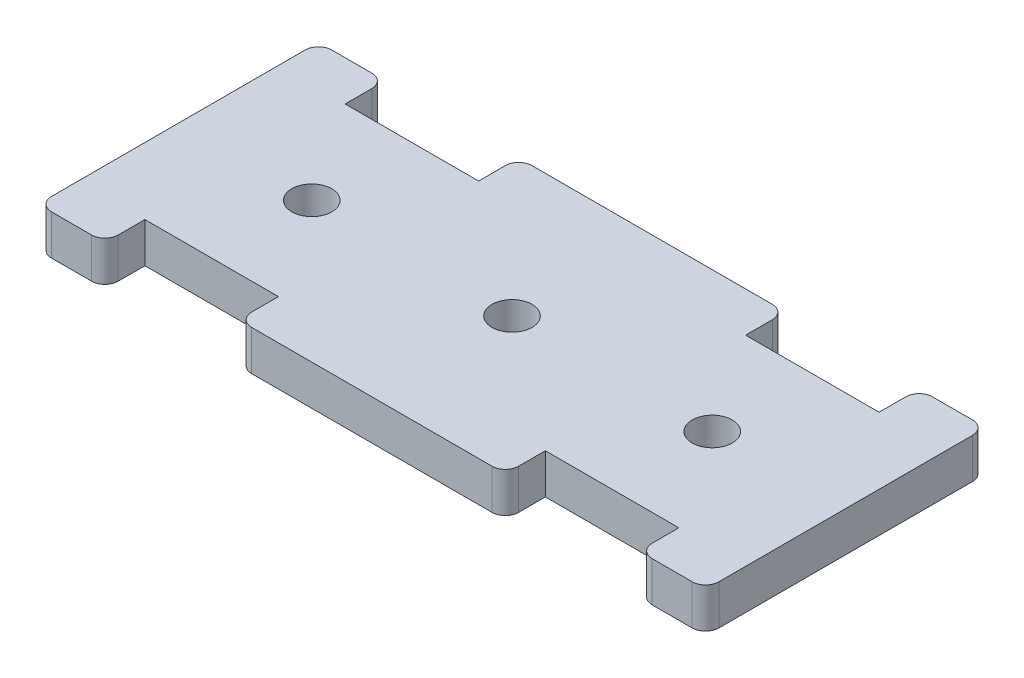
ISO-10303-21;
HEADER;
FILE_DESCRIPTION(('STEP AP214'),'2;1');
FILE_NAME('part.step','',(''),(''),'','','');
FILE_SCHEMA(('AUTOMOTIVE_DESIGN { 1 0 10303 214 1 1 1 1 }'));
ENDSEC;
DATA;
#1=APPLICATION_CONTEXT('core data for automotive mechanical design processes');
#2=APPLICATION_PROTOCOL_DEFINITION('international standard','automotive_design',2000,#1);
#3=PRODUCT_CONTEXT('',#1,'mechanical');
#4=PRODUCT('Part','Part','',(#3));
#5=PRODUCT_RELATED_PRODUCT_CATEGORY('part','',(#4));
#6=PRODUCT_DEFINITION_FORMATION('','',#4);
#7=PRODUCT_DEFINITION_CONTEXT('part definition',#1,'design');
#8=PRODUCT_DEFINITION('design','',#6,#7);
#9=PRODUCT_DEFINITION_SHAPE('','',#8);
#10=(LENGTH_UNIT() NAMED_UNIT(*) SI_UNIT(.MILLI.,.METRE.));
#11=(NAMED_UNIT(*) PLANE_ANGLE_UNIT() SI_UNIT($,.RADIAN.));
#12=(NAMED_UNIT(*) SI_UNIT($,.STERADIAN.) SOLID_ANGLE_UNIT());
#13=UNCERTAINTY_MEASURE_WITH_UNIT(LENGTH_MEASURE(1.E-05),#10,'distance_accuracy_value','');
#14=(GEOMETRIC_REPRESENTATION_CONTEXT(3) GLOBAL_UNCERTAINTY_ASSIGNED_CONTEXT((#13)) GLOBAL_UNIT_ASSIGNED_CONTEXT((#10,
#11,#12)) REPRESENTATION_CONTEXT('',''));
#15=CARTESIAN_POINT('',(0.,0.,0.));
#16=DIRECTION('',(0.,0.,1.));
#17=DIRECTION('',(1.,0.,0.));
#18=AXIS2_PLACEMENT_3D('',#15,#16,#17);
#19=CARTESIAN_POINT('',(0.,3.,0.));
#20=DIRECTION('',(0.,1.,0.));
#21=DIRECTION('',(0.,0.,1.));
#22=AXIS2_PLACEMENT_3D('',#19,#20,#21);
#23=PLANE('',#22);
#24=CARTESIAN_POINT('',(10.,3.,0.));
#25=DIRECTION('',(0.,1.,0.));
#26=DIRECTION('',(0.,0.,1.));
#27=AXIS2_PLACEMENT_3D('',#24,#25,#26);
#28=CIRCLE('',#27,1.5);
#29=CARTESIAN_POINT('',(10.,3.,1.5));
#30=VERTEX_POINT('',#29);
#31=EDGE_CURVE('E503',#30,#30,#28,.T.);
#32=ORIENTED_EDGE('',*,*,#31,.F.);
#33=EDGE_LOOP('',(#32));
#34=FACE_BOUND('',#33,.T.);
#35=DIRECTION('',(0.,0.,1.));
#36=VECTOR('',#35,1.);
#37=CARTESIAN_POINT('',(15.,3.,7.5));
#38=LINE('',#37,#36);
#39=CARTESIAN_POINT('',(15.,3.,7.5));
#40=VERTEX_POINT('',#39);
#41=CARTESIAN_POINT('',(15.,3.,9.5));
#42=VERTEX_POINT('',#41);
#43=EDGE_CURVE('E272',#40,#42,#38,.T.);
#44=ORIENTED_EDGE('',*,*,#43,.T.);
#45=CARTESIAN_POINT('',(16.,3.,9.5));
#46=DIRECTION('',(0.,1.,0.));
#47=DIRECTION('',(0.,0.,1.));
#48=AXIS2_PLACEMENT_3D('',#45,#46,#47);
#49=CIRCLE('',#48,1.);
#50=CARTESIAN_POINT('',(16.,3.,10.5));
#51=VERTEX_POINT('',#50);
#52=EDGE_CURVE('E437',#42,#51,#49,.T.);
#53=ORIENTED_EDGE('',*,*,#52,.T.);
#54=DIRECTION('',(1.,0.,0.));
#55=VECTOR('',#54,1.);
#56=CARTESIAN_POINT('',(15.,3.,10.5));
#57=LINE('',#56,#55);
#58=CARTESIAN_POINT('',(34.,3.,10.5));
#59=VERTEX_POINT('',#58);
#60=EDGE_CURVE('E274',#51,#59,#57,.T.);
#61=ORIENTED_EDGE('',*,*,#60,.T.);
#62=CARTESIAN_POINT('',(34.,3.,9.5));
#63=DIRECTION('',(0.,1.,0.));
#64=DIRECTION('',(0.,0.,1.));
#65=AXIS2_PLACEMENT_3D('',#62,#63,#64);
#66=CIRCLE('',#65,1.);
#67=CARTESIAN_POINT('',(35.,3.,9.5));
#68=VERTEX_POINT('',#67);
#69=EDGE_CURVE('E435',#59,#68,#66,.T.);
#70=ORIENTED_EDGE('',*,*,#69,.T.);
#71=DIRECTION('',(0.,0.,-1.));
#72=VECTOR('',#71,1.);
#73=CARTESIAN_POINT('',(35.,3.,10.5));
#74=LINE('',#73,#72);
#75=CARTESIAN_POINT('',(35.,3.,7.5));
#76=VERTEX_POINT('',#75);
#77=EDGE_CURVE('E280',#68,#76,#74,.T.);
#78=ORIENTED_EDGE('',*,*,#77,.T.);
#79=DIRECTION('',(1.,0.,0.));
#80=VECTOR('',#79,1.);
#81=CARTESIAN_POINT('',(35.,3.,7.5));
#82=LINE('',#81,#80);
#83=CARTESIAN_POINT('',(45.,3.,7.5));
#84=VERTEX_POINT('',#83);
#85=EDGE_CURVE('E282',#76,#84,#82,.T.);
#86=ORIENTED_EDGE('',*,*,#85,.T.);
#87=DIRECTION('',(0.,0.,1.));
#88=VECTOR('',#87,1.);
#89=CARTESIAN_POINT('',(45.,3.,7.5));
#90=LINE('',#89,#88);
#91=CARTESIAN_POINT('',(45.,3.,9.5));
#92=VERTEX_POINT('',#91);
#93=EDGE_CURVE('E284',#84,#92,#90,.T.);
#94=ORIENTED_EDGE('',*,*,#93,.T.);
#95=CARTESIAN_POINT('',(46.,3.,9.5));
#96=DIRECTION('',(0.,1.,0.));
#97=DIRECTION('',(0.,0.,1.));
#98=AXIS2_PLACEMENT_3D('',#95,#96,#97);
#99=CIRCLE('',#98,1.);
#100=CARTESIAN_POINT('',(46.,3.,10.5));
#101=VERTEX_POINT('',#100);
#102=EDGE_CURVE('E433',#92,#101,#99,.T.);
#103=ORIENTED_EDGE('',*,*,#102,.T.);
#104=DIRECTION('',(1.,0.,0.));
#105=VECTOR('',#104,1.);
#106=CARTESIAN_POINT('',(45.,3.,10.5));
#107=LINE('',#106,#105);
#108=CARTESIAN_POINT('',(49.,3.,10.5));
#109=VERTEX_POINT('',#108);
#110=EDGE_CURVE('E287',#101,#109,#107,.T.);
#111=ORIENTED_EDGE('',*,*,#110,.T.);
#112=CARTESIAN_POINT('',(49.,3.,9.5));
#113=DIRECTION('',(0.,1.,0.));
#114=DIRECTION('',(0.,0.,1.));
#115=AXIS2_PLACEMENT_3D('',#112,#113,#114);
#116=CIRCLE('',#115,1.);
#117=CARTESIAN_POINT('',(50.,3.,9.5));
#118=VERTEX_POINT('',#117);
#119=EDGE_CURVE('E431',#109,#118,#116,.T.);
#120=ORIENTED_EDGE('',*,*,#119,.T.);
#121=DIRECTION('',(0.,0.,-1.));
#122=VECTOR('',#121,1.);
#123=CARTESIAN_POINT('',(50.,3.,10.5));
#124=LINE('',#123,#122);
#125=CARTESIAN_POINT('',(50.,3.,-9.5));
#126=VERTEX_POINT('',#125);
#127=EDGE_CURVE('E290',#118,#126,#124,.T.);
#128=ORIENTED_EDGE('',*,*,#127,.T.);
#129=CARTESIAN_POINT('',(49.,3.,-9.5));
#130=DIRECTION('',(0.,1.,0.));
#131=DIRECTION('',(0.,0.,1.));
#132=AXIS2_PLACEMENT_3D('',#129,#130,#131);
#133=CIRCLE('',#132,1.);
#134=CARTESIAN_POINT('',(49.,3.,-10.5));
#135=VERTEX_POINT('',#134);
#136=EDGE_CURVE('E427',#126,#135,#133,.T.);
#137=ORIENTED_EDGE('',*,*,#136,.T.);
#138=DIRECTION('',(-1.,0.,0.));
#139=VECTOR('',#138,1.);
#140=CARTESIAN_POINT('',(45.,3.,-10.5));
#141=LINE('',#140,#139);
#142=CARTESIAN_POINT('',(46.,3.,-10.5));
#143=VERTEX_POINT('',#142);
#144=EDGE_CURVE('E293',#135,#143,#141,.T.);
#145=ORIENTED_EDGE('',*,*,#144,.T.);
#146=CARTESIAN_POINT('',(46.,3.,-9.5));
#147=DIRECTION('',(0.,1.,0.));
#148=DIRECTION('',(0.,0.,1.));
#149=AXIS2_PLACEMENT_3D('',#146,#147,#148);
#150=CIRCLE('',#149,1.);
#151=CARTESIAN_POINT('',(45.,3.,-9.5));
#152=VERTEX_POINT('',#151);
#153=EDGE_CURVE('E429',#143,#152,#150,.T.);
#154=ORIENTED_EDGE('',*,*,#153,.T.);
#155=DIRECTION('',(0.,0.,1.));
#156=VECTOR('',#155,1.);
#157=CARTESIAN_POINT('',(45.,3.,-7.5));
#158=LINE('',#157,#156);
#159=CARTESIAN_POINT('',(45.,3.,-7.5));
#160=VERTEX_POINT('',#159);
#161=EDGE_CURVE('E296',#152,#160,#158,.T.);
#162=ORIENTED_EDGE('',*,*,#161,.T.);
#163=DIRECTION('',(-1.,0.,0.));
#164=VECTOR('',#163,1.);
#165=CARTESIAN_POINT('',(35.,3.,-7.5));
#166=LINE('',#165,#164);
#167=CARTESIAN_POINT('',(35.,3.,-7.5));
#168=VERTEX_POINT('',#167);
#169=EDGE_CURVE('E298',#160,#168,#166,.T.);
#170=ORIENTED_EDGE('',*,*,#169,.T.);
#171=DIRECTION('',(0.,0.,-1.));
#172=VECTOR('',#171,1.);
#173=CARTESIAN_POINT('',(35.,3.,-10.5));
#174=LINE('',#173,#172);
#175=CARTESIAN_POINT('',(35.,3.,-9.5));
#176=VERTEX_POINT('',#175);
#177=EDGE_CURVE('E300',#168,#176,#174,.T.);
#178=ORIENTED_EDGE('',*,*,#177,.T.);
#179=CARTESIAN_POINT('',(34.,3.,-9.5));
#180=DIRECTION('',(0.,1.,0.));
#181=DIRECTION('',(0.,0.,1.));
#182=AXIS2_PLACEMENT_3D('',#179,#180,#181);
#183=CIRCLE('',#182,1.);
#184=CARTESIAN_POINT('',(34.,3.,-10.5));
#185=VERTEX_POINT('',#184);
#186=EDGE_CURVE('E425',#176,#185,#183,.T.);
#187=ORIENTED_EDGE('',*,*,#186,.T.);
#188=DIRECTION('',(-1.,0.,0.));
#189=VECTOR('',#188,1.);
#190=CARTESIAN_POINT('',(15.,3.,-10.5));
#191=LINE('',#190,#189);
#192=CARTESIAN_POINT('',(16.,3.,-10.5));
#193=VERTEX_POINT('',#192);
#194=EDGE_CURVE('E303',#185,#193,#191,.T.);
#195=ORIENTED_EDGE('',*,*,#194,.T.);
#196=CARTESIAN_POINT('',(16.,3.,-9.5));
#197=DIRECTION('',(0.,1.,0.));
#198=DIRECTION('',(0.,0.,1.));
#199=AXIS2_PLACEMENT_3D('',#196,#197,#198);
#200=CIRCLE('',#199,1.);
#201=CARTESIAN_POINT('',(15.,3.,-9.5));
#202=VERTEX_POINT('',#201);
#203=EDGE_CURVE('E423',#193,#202,#200,.T.);
#204=ORIENTED_EDGE('',*,*,#203,.T.);
#205=DIRECTION('',(0.,0.,1.));
#206=VECTOR('',#205,1.);
#207=CARTESIAN_POINT('',(15.,3.,-7.5));
#208=LINE('',#207,#206);
#209=CARTESIAN_POINT('',(15.,3.,-7.5));
#210=VERTEX_POINT('',#209);
#211=EDGE_CURVE('E306',#202,#210,#208,.T.);
#212=ORIENTED_EDGE('',*,*,#211,.T.);
#213=DIRECTION('',(-1.,0.,0.));
#214=VECTOR('',#213,1.);
#215=CARTESIAN_POINT('',(5.,3.,-7.5));
#216=LINE('',#215,#214);
#217=CARTESIAN_POINT('',(5.,3.,-7.5));
#218=VERTEX_POINT('',#217);
#219=EDGE_CURVE('E308',#210,#218,#216,.T.);
#220=ORIENTED_EDGE('',*,*,#219,.T.);
#221=DIRECTION('',(0.,0.,-1.));
#222=VECTOR('',#221,1.);
#223=CARTESIAN_POINT('',(5.,3.,-10.5));
#224=LINE('',#223,#222);
#225=CARTESIAN_POINT('',(5.,3.,-9.5));
#226=VERTEX_POINT('',#225);
#227=EDGE_CURVE('E310',#218,#226,#224,.T.);
#228=ORIENTED_EDGE('',*,*,#227,.T.);
#229=CARTESIAN_POINT('',(4.,3.,-9.5));
#230=DIRECTION('',(0.,1.,0.));
#231=DIRECTION('',(0.,0.,1.));
#232=AXIS2_PLACEMENT_3D('',#229,#230,#231);
#233=CIRCLE('',#232,1.);
#234=CARTESIAN_POINT('',(4.,3.,-10.5));
#235=VERTEX_POINT('',#234);
#236=EDGE_CURVE('E420',#226,#235,#233,.T.);
#237=ORIENTED_EDGE('',*,*,#236,.T.);
#238=DIRECTION('',(-1.,0.,0.));
#239=VECTOR('',#238,1.);
#240=CARTESIAN_POINT('',(0.,3.,-10.5));
#241=LINE('',#240,#239);
#242=CARTESIAN_POINT('',(1.,3.,-10.5));
#243=VERTEX_POINT('',#242);
#244=EDGE_CURVE('E313',#235,#243,#241,.T.);
#245=ORIENTED_EDGE('',*,*,#244,.T.);
#246=CARTESIAN_POINT('',(1.,3.,-9.5));
#247=DIRECTION('',(0.,1.,0.));
#248=DIRECTION('',(0.,0.,1.));
#249=AXIS2_PLACEMENT_3D('',#246,#247,#248);
#250=CIRCLE('',#249,1.);
#251=CARTESIAN_POINT('',(0.,3.,-9.5));
#252=VERTEX_POINT('',#251);
#253=EDGE_CURVE('E58',#243,#252,#250,.T.);
#254=ORIENTED_EDGE('',*,*,#253,.T.);
#255=DIRECTION('',(0.,0.,1.));
#256=VECTOR('',#255,1.);
#257=CARTESIAN_POINT('',(0.,3.,-10.5));
#258=LINE('',#257,#256);
#259=CARTESIAN_POINT('',(0.,3.,9.5));
#260=VERTEX_POINT('',#259);
#261=EDGE_CURVE('E315',#252,#260,#258,.T.);
#262=ORIENTED_EDGE('',*,*,#261,.T.);
#263=CARTESIAN_POINT('',(1.,3.,9.5));
#264=DIRECTION('',(0.,1.,0.));
#265=DIRECTION('',(0.,0.,1.));
#266=AXIS2_PLACEMENT_3D('',#263,#264,#265);
#267=CIRCLE('',#266,1.);
#268=CARTESIAN_POINT('',(1.,3.,10.5));
#269=VERTEX_POINT('',#268);
#270=EDGE_CURVE('E418',#260,#269,#267,.T.);
#271=ORIENTED_EDGE('',*,*,#270,.T.);
#272=DIRECTION('',(1.,0.,0.));
#273=VECTOR('',#272,1.);
#274=CARTESIAN_POINT('',(0.,3.,10.5));
#275=LINE('',#274,#273);
#276=CARTESIAN_POINT('',(4.,3.,10.5));
#277=VERTEX_POINT('',#276);
#278=EDGE_CURVE('E257',#269,#277,#275,.T.);
#279=ORIENTED_EDGE('',*,*,#278,.T.);
#280=CARTESIAN_POINT('',(4.,3.,9.5));
#281=DIRECTION('',(0.,1.,0.));
#282=DIRECTION('',(0.,0.,1.));
#283=AXIS2_PLACEMENT_3D('',#280,#281,#282);
#284=CIRCLE('',#283,1.);
#285=CARTESIAN_POINT('',(5.,3.,9.5));
#286=VERTEX_POINT('',#285);
#287=EDGE_CURVE('E254',#277,#286,#284,.T.);
#288=ORIENTED_EDGE('',*,*,#287,.T.);
#289=DIRECTION('',(0.,0.,-1.));
#290=VECTOR('',#289,1.);
#291=CARTESIAN_POINT('',(5.,3.,10.5));
#292=LINE('',#291,#290);
#293=CARTESIAN_POINT('',(5.,3.,7.5));
#294=VERTEX_POINT('',#293);
#295=EDGE_CURVE('E245',#286,#294,#292,.T.);
#296=ORIENTED_EDGE('',*,*,#295,.T.);
#297=DIRECTION('',(1.,0.,0.));
#298=VECTOR('',#297,1.);
#299=CARTESIAN_POINT('',(5.,3.,7.5));
#300=LINE('',#299,#298);
#301=EDGE_CURVE('E250',#294,#40,#300,.T.);
#302=ORIENTED_EDGE('',*,*,#301,.T.);
#303=EDGE_LOOP('',(#44,#53,#61,#70,#78,#86,#94,#103,#111,#120,#128,#137,#145,#154,#162,#170,
#178,#187,#195,#204,#212,#220,#228,#237,#245,#254,#262,#271,#279,#288,#296,#302));
#304=FACE_BOUND('',#303,.T.);
#305=CARTESIAN_POINT('',(40.,3.,0.));
#306=DIRECTION('',(0.,1.,0.));
#307=DIRECTION('',(0.,0.,1.));
#308=AXIS2_PLACEMENT_3D('',#305,#306,#307);
#309=CIRCLE('',#308,1.5);
#310=CARTESIAN_POINT('',(40.,3.,1.5));
#311=VERTEX_POINT('',#310);
#312=EDGE_CURVE('E321',#311,#311,#309,.T.);
#313=ORIENTED_EDGE('',*,*,#312,.F.);
#314=EDGE_LOOP('',(#313));
#315=FACE_BOUND('',#314,.T.);
#316=CARTESIAN_POINT('',(25.,3.,0.));
#317=DIRECTION('',(0.,1.,0.));
#318=DIRECTION('',(0.,0.,1.));
#319=AXIS2_PLACEMENT_3D('',#316,#317,#318);
#320=CIRCLE('',#319,1.5);
#321=CARTESIAN_POINT('',(25.,3.,1.5));
#322=VERTEX_POINT('',#321);
#323=EDGE_CURVE('E509',#322,#322,#320,.T.);
#324=ORIENTED_EDGE('',*,*,#323,.F.);
#325=EDGE_LOOP('',(#324));
#326=FACE_BOUND('',#325,.T.);
#327=ADVANCED_FACE('F36',(#34,#304,#315,#326),#23,.T.);
#328=CARTESIAN_POINT('',(0.,0.,0.));
#329=DIRECTION('',(0.,1.,0.));
#330=DIRECTION('',(0.,0.,1.));
#331=AXIS2_PLACEMENT_3D('',#328,#329,#330);
#332=PLANE('',#331);
#333=DIRECTION('',(1.,0.,0.));
#334=VECTOR('',#333,1.);
#335=CARTESIAN_POINT('',(15.,0.,10.5));
#336=LINE('',#335,#334);
#337=CARTESIAN_POINT('',(16.,0.,10.5));
#338=VERTEX_POINT('',#337);
#339=CARTESIAN_POINT('',(34.,0.,10.5));
#340=VERTEX_POINT('',#339);
#341=EDGE_CURVE('E328',#338,#340,#336,.T.);
#342=ORIENTED_EDGE('',*,*,#341,.F.);
#343=CARTESIAN_POINT('',(16.,0.,9.5));
#344=DIRECTION('',(0.,1.,0.));
#345=DIRECTION('',(0.,0.,1.));
#346=AXIS2_PLACEMENT_3D('',#343,#344,#345);
#347=CIRCLE('',#346,1.);
#348=CARTESIAN_POINT('',(15.,0.,9.5));
#349=VERTEX_POINT('',#348);
#350=EDGE_CURVE('E413',#338,#349,#347,.F.);
#351=ORIENTED_EDGE('',*,*,#350,.T.);
#352=DIRECTION('',(0.,0.,1.));
#353=VECTOR('',#352,1.);
#354=CARTESIAN_POINT('',(15.,0.,7.5));
#355=LINE('',#354,#353);
#356=CARTESIAN_POINT('',(15.,0.,7.5));
#357=VERTEX_POINT('',#356);
#358=EDGE_CURVE('E325',#357,#349,#355,.T.);
#359=ORIENTED_EDGE('',*,*,#358,.F.);
#360=DIRECTION('',(1.,0.,0.));
#361=VECTOR('',#360,1.);
#362=CARTESIAN_POINT('',(5.,0.,7.5));
#363=LINE('',#362,#361);
#364=CARTESIAN_POINT('',(5.,0.,7.5));
#365=VERTEX_POINT('',#364);
#366=EDGE_CURVE('E323',#365,#357,#363,.T.);
#367=ORIENTED_EDGE('',*,*,#366,.F.);
#368=DIRECTION('',(0.,0.,-1.));
#369=VECTOR('',#368,1.);
#370=CARTESIAN_POINT('',(5.,0.,10.5));
#371=LINE('',#370,#369);
#372=CARTESIAN_POINT('',(5.,0.,9.5));
#373=VERTEX_POINT('',#372);
#374=EDGE_CURVE('E263',#373,#365,#371,.T.);
#375=ORIENTED_EDGE('',*,*,#374,.F.);
#376=CARTESIAN_POINT('',(4.,0.,9.5));
#377=DIRECTION('',(0.,1.,0.));
#378=DIRECTION('',(0.,0.,1.));
#379=AXIS2_PLACEMENT_3D('',#376,#377,#378);
#380=CIRCLE('',#379,1.);
#381=CARTESIAN_POINT('',(4.,0.,10.5));
#382=VERTEX_POINT('',#381);
#383=EDGE_CURVE('E391',#373,#382,#380,.F.);
#384=ORIENTED_EDGE('',*,*,#383,.T.);
#385=DIRECTION('',(1.,0.,0.));
#386=VECTOR('',#385,1.);
#387=CARTESIAN_POINT('',(0.,0.,10.5));
#388=LINE('',#387,#386);
#389=CARTESIAN_POINT('',(1.,0.,10.5));
#390=VERTEX_POINT('',#389);
#391=EDGE_CURVE('E318',#390,#382,#388,.T.);
#392=ORIENTED_EDGE('',*,*,#391,.F.);
#393=CARTESIAN_POINT('',(1.,0.,9.5));
#394=DIRECTION('',(0.,1.,0.));
#395=DIRECTION('',(0.,0.,1.));
#396=AXIS2_PLACEMENT_3D('',#393,#394,#395);
#397=CIRCLE('',#396,1.);
#398=CARTESIAN_POINT('',(0.,0.,9.5));
#399=VERTEX_POINT('',#398);
#400=EDGE_CURVE('E393',#390,#399,#397,.F.);
#401=ORIENTED_EDGE('',*,*,#400,.T.);
#402=DIRECTION('',(0.,0.,1.));
#403=VECTOR('',#402,1.);
#404=CARTESIAN_POINT('',(0.,0.,-10.5));
#405=LINE('',#404,#403);
#406=CARTESIAN_POINT('',(0.,0.,-9.5));
#407=VERTEX_POINT('',#406);
#408=EDGE_CURVE('E367',#407,#399,#405,.T.);
#409=ORIENTED_EDGE('',*,*,#408,.F.);
#410=CARTESIAN_POINT('',(1.,0.,-9.5));
#411=DIRECTION('',(0.,1.,0.));
#412=DIRECTION('',(0.,0.,1.));
#413=AXIS2_PLACEMENT_3D('',#410,#411,#412);
#414=CIRCLE('',#413,1.);
#415=CARTESIAN_POINT('',(1.,0.,-10.5));
#416=VERTEX_POINT('',#415);
#417=EDGE_CURVE('E397',#407,#416,#414,.F.);
#418=ORIENTED_EDGE('',*,*,#417,.T.);
#419=DIRECTION('',(-1.,0.,0.));
#420=VECTOR('',#419,1.);
#421=CARTESIAN_POINT('',(0.,0.,-10.5));
#422=LINE('',#421,#420);
#423=CARTESIAN_POINT('',(4.,0.,-10.5));
#424=VERTEX_POINT('',#423);
#425=EDGE_CURVE('E364',#424,#416,#422,.T.);
#426=ORIENTED_EDGE('',*,*,#425,.F.);
#427=CARTESIAN_POINT('',(4.,0.,-9.5));
#428=DIRECTION('',(0.,1.,0.));
#429=DIRECTION('',(0.,0.,1.));
#430=AXIS2_PLACEMENT_3D('',#427,#428,#429);
#431=CIRCLE('',#430,1.);
#432=CARTESIAN_POINT('',(5.,0.,-9.5));
#433=VERTEX_POINT('',#432);
#434=EDGE_CURVE('E395',#424,#433,#431,.F.);
#435=ORIENTED_EDGE('',*,*,#434,.T.);
#436=DIRECTION('',(0.,0.,-1.));
#437=VECTOR('',#436,1.);
#438=CARTESIAN_POINT('',(5.,0.,-10.5));
#439=LINE('',#438,#437);
#440=CARTESIAN_POINT('',(5.,0.,-7.5));
#441=VERTEX_POINT('',#440);
#442=EDGE_CURVE('E361',#441,#433,#439,.T.);
#443=ORIENTED_EDGE('',*,*,#442,.F.);
#444=DIRECTION('',(-1.,0.,0.));
#445=VECTOR('',#444,1.);
#446=CARTESIAN_POINT('',(5.,0.,-7.5));
#447=LINE('',#446,#445);
#448=CARTESIAN_POINT('',(15.,0.,-7.5));
#449=VERTEX_POINT('',#448);
#450=EDGE_CURVE('E359',#449,#441,#447,.T.);
#451=ORIENTED_EDGE('',*,*,#450,.F.);
#452=DIRECTION('',(0.,0.,1.));
#453=VECTOR('',#452,1.);
#454=CARTESIAN_POINT('',(15.,0.,-7.5));
#455=LINE('',#454,#453);
#456=CARTESIAN_POINT('',(15.,0.,-9.5));
#457=VERTEX_POINT('',#456);
#458=EDGE_CURVE('E357',#457,#449,#455,.T.);
#459=ORIENTED_EDGE('',*,*,#458,.F.);
#460=CARTESIAN_POINT('',(16.,0.,-9.5));
#461=DIRECTION('',(0.,1.,0.));
#462=DIRECTION('',(0.,0.,1.));
#463=AXIS2_PLACEMENT_3D('',#460,#461,#462);
#464=CIRCLE('',#463,1.);
#465=CARTESIAN_POINT('',(16.,0.,-10.5));
#466=VERTEX_POINT('',#465);
#467=EDGE_CURVE('E399',#457,#466,#464,.F.);
#468=ORIENTED_EDGE('',*,*,#467,.T.);
#469=DIRECTION('',(-1.,0.,0.));
#470=VECTOR('',#469,1.);
#471=CARTESIAN_POINT('',(15.,0.,-10.5));
#472=LINE('',#471,#470);
#473=CARTESIAN_POINT('',(34.,0.,-10.5));
#474=VERTEX_POINT('',#473);
#475=EDGE_CURVE('E354',#474,#466,#472,.T.);
#476=ORIENTED_EDGE('',*,*,#475,.F.);
#477=CARTESIAN_POINT('',(34.,0.,-9.5));
#478=DIRECTION('',(0.,1.,0.));
#479=DIRECTION('',(0.,0.,1.));
#480=AXIS2_PLACEMENT_3D('',#477,#478,#479);
#481=CIRCLE('',#480,1.);
#482=CARTESIAN_POINT('',(35.,0.,-9.5));
#483=VERTEX_POINT('',#482);
#484=EDGE_CURVE('E401',#474,#483,#481,.F.);
#485=ORIENTED_EDGE('',*,*,#484,.T.);
#486=DIRECTION('',(0.,0.,-1.));
#487=VECTOR('',#486,1.);
#488=CARTESIAN_POINT('',(35.,0.,-10.5));
#489=LINE('',#488,#487);
#490=CARTESIAN_POINT('',(35.,0.,-7.5));
#491=VERTEX_POINT('',#490);
#492=EDGE_CURVE('E351',#491,#483,#489,.T.);
#493=ORIENTED_EDGE('',*,*,#492,.F.);
#494=DIRECTION('',(-1.,0.,0.));
#495=VECTOR('',#494,1.);
#496=CARTESIAN_POINT('',(35.,0.,-7.5));
#497=LINE('',#496,#495);
#498=CARTESIAN_POINT('',(45.,0.,-7.5));
#499=VERTEX_POINT('',#498);
#500=EDGE_CURVE('E349',#499,#491,#497,.T.);
#501=ORIENTED_EDGE('',*,*,#500,.F.);
#502=DIRECTION('',(0.,0.,1.));
#503=VECTOR('',#502,1.);
#504=CARTESIAN_POINT('',(45.,0.,-7.5));
#505=LINE('',#504,#503);
#506=CARTESIAN_POINT('',(45.,0.,-9.5));
#507=VERTEX_POINT('',#506);
#508=EDGE_CURVE('E347',#507,#499,#505,.T.);
#509=ORIENTED_EDGE('',*,*,#508,.F.);
#510=CARTESIAN_POINT('',(46.,0.,-9.5));
#511=DIRECTION('',(0.,1.,0.));
#512=DIRECTION('',(0.,0.,1.));
#513=AXIS2_PLACEMENT_3D('',#510,#511,#512);
#514=CIRCLE('',#513,1.);
#515=CARTESIAN_POINT('',(46.,0.,-10.5));
#516=VERTEX_POINT('',#515);
#517=EDGE_CURVE('E405',#507,#516,#514,.F.);
#518=ORIENTED_EDGE('',*,*,#517,.T.);
#519=DIRECTION('',(-1.,0.,0.));
#520=VECTOR('',#519,1.);
#521=CARTESIAN_POINT('',(45.,0.,-10.5));
#522=LINE('',#521,#520);
#523=CARTESIAN_POINT('',(49.,0.,-10.5));
#524=VERTEX_POINT('',#523);
#525=EDGE_CURVE('E344',#524,#516,#522,.T.);
#526=ORIENTED_EDGE('',*,*,#525,.F.);
#527=CARTESIAN_POINT('',(49.,0.,-9.5));
#528=DIRECTION('',(0.,1.,0.));
#529=DIRECTION('',(0.,0.,1.));
#530=AXIS2_PLACEMENT_3D('',#527,#528,#529);
#531=CIRCLE('',#530,1.);
#532=CARTESIAN_POINT('',(50.,0.,-9.5));
#533=VERTEX_POINT('',#532);
#534=EDGE_CURVE('E403',#524,#533,#531,.F.);
#535=ORIENTED_EDGE('',*,*,#534,.T.);
#536=DIRECTION('',(0.,0.,-1.));
#537=VECTOR('',#536,1.);
#538=CARTESIAN_POINT('',(50.,0.,10.5));
#539=LINE('',#538,#537);
#540=CARTESIAN_POINT('',(50.,0.,9.5));
#541=VERTEX_POINT('',#540);
#542=EDGE_CURVE('E341',#541,#533,#539,.T.);
#543=ORIENTED_EDGE('',*,*,#542,.F.);
#544=CARTESIAN_POINT('',(49.,0.,9.5));
#545=DIRECTION('',(0.,1.,0.));
#546=DIRECTION('',(0.,0.,1.));
#547=AXIS2_PLACEMENT_3D('',#544,#545,#546);
#548=CIRCLE('',#547,1.);
#549=CARTESIAN_POINT('',(49.,0.,10.5));
#550=VERTEX_POINT('',#549);
#551=EDGE_CURVE('E407',#541,#550,#548,.F.);
#552=ORIENTED_EDGE('',*,*,#551,.T.);
#553=DIRECTION('',(1.,0.,0.));
#554=VECTOR('',#553,1.);
#555=CARTESIAN_POINT('',(45.,0.,10.5));
#556=LINE('',#555,#554);
#557=CARTESIAN_POINT('',(46.,0.,10.5));
#558=VERTEX_POINT('',#557);
#559=EDGE_CURVE('E338',#558,#550,#556,.T.);
#560=ORIENTED_EDGE('',*,*,#559,.F.);
#561=CARTESIAN_POINT('',(46.,0.,9.5));
#562=DIRECTION('',(0.,1.,0.));
#563=DIRECTION('',(0.,0.,1.));
#564=AXIS2_PLACEMENT_3D('',#561,#562,#563);
#565=CIRCLE('',#564,1.);
#566=CARTESIAN_POINT('',(45.,0.,9.5));
#567=VERTEX_POINT('',#566);
#568=EDGE_CURVE('E409',#558,#567,#565,.F.);
#569=ORIENTED_EDGE('',*,*,#568,.T.);
#570=DIRECTION('',(0.,0.,1.));
#571=VECTOR('',#570,1.);
#572=CARTESIAN_POINT('',(45.,0.,7.5));
#573=LINE('',#572,#571);
#574=CARTESIAN_POINT('',(45.,0.,7.5));
#575=VERTEX_POINT('',#574);
#576=EDGE_CURVE('E335',#575,#567,#573,.T.);
#577=ORIENTED_EDGE('',*,*,#576,.F.);
#578=DIRECTION('',(1.,0.,0.));
#579=VECTOR('',#578,1.);
#580=CARTESIAN_POINT('',(35.,0.,7.5));
#581=LINE('',#580,#579);
#582=CARTESIAN_POINT('',(35.,0.,7.5));
#583=VERTEX_POINT('',#582);
#584=EDGE_CURVE('E333',#583,#575,#581,.T.);
#585=ORIENTED_EDGE('',*,*,#584,.F.);
#586=DIRECTION('',(0.,0.,-1.));
#587=VECTOR('',#586,1.);
#588=CARTESIAN_POINT('',(35.,0.,10.5));
#589=LINE('',#588,#587);
#590=CARTESIAN_POINT('',(35.,0.,9.5));
#591=VERTEX_POINT('',#590);
#592=EDGE_CURVE('E331',#591,#583,#589,.T.);
#593=ORIENTED_EDGE('',*,*,#592,.F.);
#594=CARTESIAN_POINT('',(34.,0.,9.5));
#595=DIRECTION('',(0.,1.,0.));
#596=DIRECTION('',(0.,0.,1.));
#597=AXIS2_PLACEMENT_3D('',#594,#595,#596);
#598=CIRCLE('',#597,1.);
#599=EDGE_CURVE('E411',#591,#340,#598,.F.);
#600=ORIENTED_EDGE('',*,*,#599,.T.);
#601=EDGE_LOOP('',(#342,#351,#359,#367,#375,#384,#392,#401,#409,#418,#426,#435,#443,#451,#459,
#468,#476,#485,#493,#501,#509,#518,#526,#535,#543,#552,#560,#569,#577,#585,#593,#600));
#602=FACE_BOUND('',#601,.T.);
#603=CARTESIAN_POINT('',(40.,0.,0.));
#604=DIRECTION('',(0.,1.,0.));
#605=DIRECTION('',(0.,0.,1.));
#606=AXIS2_PLACEMENT_3D('',#603,#604,#605);
#607=CIRCLE('',#606,1.5);
#608=CARTESIAN_POINT('',(40.,0.,1.5));
#609=VERTEX_POINT('',#608);
#610=EDGE_CURVE('E500',#609,#609,#607,.T.);
#611=ORIENTED_EDGE('',*,*,#610,.T.);
#612=EDGE_LOOP('',(#611));
#613=FACE_BOUND('',#612,.T.);
#614=CARTESIAN_POINT('',(10.,0.,0.));
#615=DIRECTION('',(0.,1.,0.));
#616=DIRECTION('',(0.,0.,1.));
#617=AXIS2_PLACEMENT_3D('',#614,#615,#616);
#618=CIRCLE('',#617,1.5);
#619=CARTESIAN_POINT('',(10.,0.,1.5));
#620=VERTEX_POINT('',#619);
#621=EDGE_CURVE('E506',#620,#620,#618,.T.);
#622=ORIENTED_EDGE('',*,*,#621,.T.);
#623=EDGE_LOOP('',(#622));
#624=FACE_BOUND('',#623,.T.);
#625=CARTESIAN_POINT('',(25.,0.,0.));
#626=DIRECTION('',(0.,1.,0.));
#627=DIRECTION('',(0.,0.,1.));
#628=AXIS2_PLACEMENT_3D('',#625,#626,#627);
#629=CIRCLE('',#628,1.5);
#630=CARTESIAN_POINT('',(25.,0.,1.5));
#631=VERTEX_POINT('',#630);
#632=EDGE_CURVE('E512',#631,#631,#629,.T.);
#633=ORIENTED_EDGE('',*,*,#632,.T.);
#634=EDGE_LOOP('',(#633));
#635=FACE_BOUND('',#634,.T.);
#636=ADVANCED_FACE('F495',(#602,#613,#624,#635),#332,.F.);
#637=CARTESIAN_POINT('',(0.,3.,10.5));
#638=DIRECTION('',(0.,0.,-1.));
#639=DIRECTION('',(-1.,0.,0.));
#640=AXIS2_PLACEMENT_3D('',#637,#638,#639);
#641=PLANE('',#640);
#642=ORIENTED_EDGE('',*,*,#278,.F.);
#643=DIRECTION('',(0.,-1.,0.));
#644=VECTOR('',#643,1.);
#645=CARTESIAN_POINT('',(1.,3.,10.5));
#646=LINE('',#645,#644);
#647=EDGE_CURVE('E44',#269,#390,#646,.T.);
#648=ORIENTED_EDGE('',*,*,#647,.T.);
#649=ORIENTED_EDGE('',*,*,#391,.T.);
#650=DIRECTION('',(0.,-1.,0.));
#651=VECTOR('',#650,1.);
#652=CARTESIAN_POINT('',(4.,3.,10.5));
#653=LINE('',#652,#651);
#654=EDGE_CURVE('E483',#382,#277,#653,.F.);
#655=ORIENTED_EDGE('',*,*,#654,.T.);
#656=EDGE_LOOP('',(#642,#648,#649,#655));
#657=FACE_BOUND('',#656,.T.);
#658=ADVANCED_FACE('F489',(#657),#641,.F.);
#659=CARTESIAN_POINT('',(5.,3.,10.5));
#660=DIRECTION('',(-1.,0.,0.));
#661=DIRECTION('',(0.,0.,1.));
#662=AXIS2_PLACEMENT_3D('',#659,#660,#661);
#663=PLANE('',#662);
#664=ORIENTED_EDGE('',*,*,#295,.F.);
#665=DIRECTION('',(0.,-1.,0.));
#666=VECTOR('',#665,1.);
#667=CARTESIAN_POINT('',(5.,3.,9.5));
#668=LINE('',#667,#666);
#669=EDGE_CURVE('E11',#286,#373,#668,.T.);
#670=ORIENTED_EDGE('',*,*,#669,.T.);
#671=ORIENTED_EDGE('',*,*,#374,.T.);
#672=DIRECTION('',(0.,-1.,0.));
#673=VECTOR('',#672,1.);
#674=CARTESIAN_POINT('',(5.,3.,7.5));
#675=LINE('',#674,#673);
#676=EDGE_CURVE('E260',#294,#365,#675,.T.);
#677=ORIENTED_EDGE('',*,*,#676,.F.);
#678=EDGE_LOOP('',(#664,#670,#671,#677));
#679=FACE_BOUND('',#678,.T.);
#680=ADVANCED_FACE('F261',(#679),#663,.F.);
#681=CARTESIAN_POINT('',(5.,3.,7.5));
#682=DIRECTION('',(0.,0.,-1.));
#683=DIRECTION('',(-1.,0.,0.));
#684=AXIS2_PLACEMENT_3D('',#681,#682,#683);
#685=PLANE('',#684);
#686=ORIENTED_EDGE('',*,*,#366,.T.);
#687=DIRECTION('',(0.,-1.,0.));
#688=VECTOR('',#687,1.);
#689=CARTESIAN_POINT('',(15.,3.,7.5));
#690=LINE('',#689,#688);
#691=EDGE_CURVE('E267',#40,#357,#690,.T.);
#692=ORIENTED_EDGE('',*,*,#691,.F.);
#693=ORIENTED_EDGE('',*,*,#301,.F.);
#694=ORIENTED_EDGE('',*,*,#676,.T.);
#695=EDGE_LOOP('',(#686,#692,#693,#694));
#696=FACE_BOUND('',#695,.T.);
#697=ADVANCED_FACE('F269',(#696),#685,.F.);
#698=CARTESIAN_POINT('',(15.,3.,7.5));
#699=DIRECTION('',(1.,0.,0.));
#700=DIRECTION('',(0.,0.,-1.));
#701=AXIS2_PLACEMENT_3D('',#698,#699,#700);
#702=PLANE('',#701);
#703=ORIENTED_EDGE('',*,*,#358,.T.);
#704=DIRECTION('',(0.,-1.,0.));
#705=VECTOR('',#704,1.);
#706=CARTESIAN_POINT('',(15.,3.,9.5));
#707=LINE('',#706,#705);
#708=EDGE_CURVE('E415',#349,#42,#707,.F.);
#709=ORIENTED_EDGE('',*,*,#708,.T.);
#710=ORIENTED_EDGE('',*,*,#43,.F.);
#711=ORIENTED_EDGE('',*,*,#691,.T.);
#712=EDGE_LOOP('',(#703,#709,#710,#711));
#713=FACE_BOUND('',#712,.T.);
#714=ADVANCED_FACE('F595',(#713),#702,.F.);
#715=CARTESIAN_POINT('',(15.,3.,10.5));
#716=DIRECTION('',(0.,0.,-1.));
#717=DIRECTION('',(-1.,0.,0.));
#718=AXIS2_PLACEMENT_3D('',#715,#716,#717);
#719=PLANE('',#718);
#720=ORIENTED_EDGE('',*,*,#60,.F.);
#721=DIRECTION('',(0.,-1.,0.));
#722=VECTOR('',#721,1.);
#723=CARTESIAN_POINT('',(16.,3.,10.5));
#724=LINE('',#723,#722);
#725=EDGE_CURVE('E388',#51,#338,#724,.T.);
#726=ORIENTED_EDGE('',*,*,#725,.T.);
#727=ORIENTED_EDGE('',*,*,#341,.T.);
#728=DIRECTION('',(0.,-1.,0.));
#729=VECTOR('',#728,1.);
#730=CARTESIAN_POINT('',(34.,3.,10.5));
#731=LINE('',#730,#729);
#732=EDGE_CURVE('E266',#340,#59,#731,.F.);
#733=ORIENTED_EDGE('',*,*,#732,.T.);
#734=EDGE_LOOP('',(#720,#726,#727,#733));
#735=FACE_BOUND('',#734,.T.);
#736=ADVANCED_FACE('F591',(#735),#719,.F.);
#737=CARTESIAN_POINT('',(35.,3.,10.5));
#738=DIRECTION('',(-1.,0.,0.));
#739=DIRECTION('',(0.,0.,1.));
#740=AXIS2_PLACEMENT_3D('',#737,#738,#739);
#741=PLANE('',#740);
#742=ORIENTED_EDGE('',*,*,#77,.F.);
#743=DIRECTION('',(0.,-1.,0.));
#744=VECTOR('',#743,1.);
#745=CARTESIAN_POINT('',(35.,3.,9.5));
#746=LINE('',#745,#744);
#747=EDGE_CURVE('E439',#68,#591,#746,.T.);
#748=ORIENTED_EDGE('',*,*,#747,.T.);
#749=ORIENTED_EDGE('',*,*,#592,.T.);
#750=DIRECTION('',(0.,-1.,0.));
#751=VECTOR('',#750,1.);
#752=CARTESIAN_POINT('',(35.,3.,7.5));
#753=LINE('',#752,#751);
#754=EDGE_CURVE('E383',#76,#583,#753,.T.);
#755=ORIENTED_EDGE('',*,*,#754,.F.);
#756=EDGE_LOOP('',(#742,#748,#749,#755));
#757=FACE_BOUND('',#756,.T.);
#758=ADVANCED_FACE('F587',(#757),#741,.F.);
#759=CARTESIAN_POINT('',(35.,3.,7.5));
#760=DIRECTION('',(0.,0.,-1.));
#761=DIRECTION('',(-1.,0.,0.));
#762=AXIS2_PLACEMENT_3D('',#759,#760,#761);
#763=PLANE('',#762);
#764=ORIENTED_EDGE('',*,*,#584,.T.);
#765=DIRECTION('',(0.,-1.,0.));
#766=VECTOR('',#765,1.);
#767=CARTESIAN_POINT('',(45.,3.,7.5));
#768=LINE('',#767,#766);
#769=EDGE_CURVE('E380',#84,#575,#768,.T.);
#770=ORIENTED_EDGE('',*,*,#769,.F.);
#771=ORIENTED_EDGE('',*,*,#85,.F.);
#772=ORIENTED_EDGE('',*,*,#754,.T.);
#773=EDGE_LOOP('',(#764,#770,#771,#772));
#774=FACE_BOUND('',#773,.T.);
#775=ADVANCED_FACE('F583',(#774),#763,.F.);
#776=CARTESIAN_POINT('',(45.,3.,7.5));
#777=DIRECTION('',(1.,0.,0.));
#778=DIRECTION('',(0.,0.,-1.));
#779=AXIS2_PLACEMENT_3D('',#776,#777,#778);
#780=PLANE('',#779);
#781=ORIENTED_EDGE('',*,*,#576,.T.);
#782=DIRECTION('',(0.,-1.,0.));
#783=VECTOR('',#782,1.);
#784=CARTESIAN_POINT('',(45.,3.,9.5));
#785=LINE('',#784,#783);
#786=EDGE_CURVE('E447',#567,#92,#785,.F.);
#787=ORIENTED_EDGE('',*,*,#786,.T.);
#788=ORIENTED_EDGE('',*,*,#93,.F.);
#789=ORIENTED_EDGE('',*,*,#769,.T.);
#790=EDGE_LOOP('',(#781,#787,#788,#789));
#791=FACE_BOUND('',#790,.T.);
#792=ADVANCED_FACE('F579',(#791),#780,.F.);
#793=CARTESIAN_POINT('',(45.,3.,10.5));
#794=DIRECTION('',(0.,0.,-1.));
#795=DIRECTION('',(-1.,0.,0.));
#796=AXIS2_PLACEMENT_3D('',#793,#794,#795);
#797=PLANE('',#796);
#798=ORIENTED_EDGE('',*,*,#110,.F.);
#799=DIRECTION('',(0.,-1.,0.));
#800=VECTOR('',#799,1.);
#801=CARTESIAN_POINT('',(46.,3.,10.5));
#802=LINE('',#801,#800);
#803=EDGE_CURVE('E444',#101,#558,#802,.T.);
#804=ORIENTED_EDGE('',*,*,#803,.T.);
#805=ORIENTED_EDGE('',*,*,#559,.T.);
#806=DIRECTION('',(0.,-1.,0.));
#807=VECTOR('',#806,1.);
#808=CARTESIAN_POINT('',(49.,3.,10.5));
#809=LINE('',#808,#807);
#810=EDGE_CURVE('E442',#550,#109,#809,.F.);
#811=ORIENTED_EDGE('',*,*,#810,.T.);
#812=EDGE_LOOP('',(#798,#804,#805,#811));
#813=FACE_BOUND('',#812,.T.);
#814=ADVANCED_FACE('F575',(#813),#797,.F.);
#815=CARTESIAN_POINT('',(50.,3.,10.5));
#816=DIRECTION('',(-1.,0.,0.));
#817=DIRECTION('',(0.,0.,1.));
#818=AXIS2_PLACEMENT_3D('',#815,#816,#817);
#819=PLANE('',#818);
#820=ORIENTED_EDGE('',*,*,#127,.F.);
#821=DIRECTION('',(0.,-1.,0.));
#822=VECTOR('',#821,1.);
#823=CARTESIAN_POINT('',(50.,3.,9.5));
#824=LINE('',#823,#822);
#825=EDGE_CURVE('E451',#118,#541,#824,.T.);
#826=ORIENTED_EDGE('',*,*,#825,.T.);
#827=ORIENTED_EDGE('',*,*,#542,.T.);
#828=DIRECTION('',(0.,-1.,0.));
#829=VECTOR('',#828,1.);
#830=CARTESIAN_POINT('',(50.,3.,-9.5));
#831=LINE('',#830,#829);
#832=EDGE_CURVE('E449',#533,#126,#831,.F.);
#833=ORIENTED_EDGE('',*,*,#832,.T.);
#834=EDGE_LOOP('',(#820,#826,#827,#833));
#835=FACE_BOUND('',#834,.T.);
#836=ADVANCED_FACE('F571',(#835),#819,.F.);
#837=CARTESIAN_POINT('',(45.,3.,-10.5));
#838=DIRECTION('',(0.,0.,1.));
#839=DIRECTION('',(1.,0.,0.));
#840=AXIS2_PLACEMENT_3D('',#837,#838,#839);
#841=PLANE('',#840);
#842=ORIENTED_EDGE('',*,*,#525,.T.);
#843=DIRECTION('',(0.,-1.,0.));
#844=VECTOR('',#843,1.);
#845=CARTESIAN_POINT('',(46.,3.,-10.5));
#846=LINE('',#845,#844);
#847=EDGE_CURVE('E460',#516,#143,#846,.F.);
#848=ORIENTED_EDGE('',*,*,#847,.T.);
#849=ORIENTED_EDGE('',*,*,#144,.F.);
#850=DIRECTION('',(0.,-1.,0.));
#851=VECTOR('',#850,1.);
#852=CARTESIAN_POINT('',(49.,3.,-10.5));
#853=LINE('',#852,#851);
#854=EDGE_CURVE('E457',#135,#524,#853,.T.);
#855=ORIENTED_EDGE('',*,*,#854,.T.);
#856=EDGE_LOOP('',(#842,#848,#849,#855));
#857=FACE_BOUND('',#856,.T.);
#858=ADVANCED_FACE('F567',(#857),#841,.F.);
#859=CARTESIAN_POINT('',(45.,3.,-7.5));
#860=DIRECTION('',(1.,0.,0.));
#861=DIRECTION('',(0.,0.,-1.));
#862=AXIS2_PLACEMENT_3D('',#859,#860,#861);
#863=PLANE('',#862);
#864=ORIENTED_EDGE('',*,*,#161,.F.);
#865=DIRECTION('',(0.,-1.,0.));
#866=VECTOR('',#865,1.);
#867=CARTESIAN_POINT('',(45.,3.,-9.5));
#868=LINE('',#867,#866);
#869=EDGE_CURVE('E454',#152,#507,#868,.T.);
#870=ORIENTED_EDGE('',*,*,#869,.T.);
#871=ORIENTED_EDGE('',*,*,#508,.T.);
#872=DIRECTION('',(0.,-1.,0.));
#873=VECTOR('',#872,1.);
#874=CARTESIAN_POINT('',(45.,3.,-7.5));
#875=LINE('',#874,#873);
#876=EDGE_CURVE('E377',#160,#499,#875,.T.);
#877=ORIENTED_EDGE('',*,*,#876,.F.);
#878=EDGE_LOOP('',(#864,#870,#871,#877));
#879=FACE_BOUND('',#878,.T.);
#880=ADVANCED_FACE('F563',(#879),#863,.F.);
#881=CARTESIAN_POINT('',(35.,3.,-7.5));
#882=DIRECTION('',(0.,0.,1.));
#883=DIRECTION('',(1.,0.,0.));
#884=AXIS2_PLACEMENT_3D('',#881,#882,#883);
#885=PLANE('',#884);
#886=ORIENTED_EDGE('',*,*,#500,.T.);
#887=DIRECTION('',(0.,-1.,0.));
#888=VECTOR('',#887,1.);
#889=CARTESIAN_POINT('',(35.,3.,-7.5));
#890=LINE('',#889,#888);
#891=EDGE_CURVE('E374',#168,#491,#890,.T.);
#892=ORIENTED_EDGE('',*,*,#891,.F.);
#893=ORIENTED_EDGE('',*,*,#169,.F.);
#894=ORIENTED_EDGE('',*,*,#876,.T.);
#895=EDGE_LOOP('',(#886,#892,#893,#894));
#896=FACE_BOUND('',#895,.T.);
#897=ADVANCED_FACE('F559',(#896),#885,.F.);
#898=CARTESIAN_POINT('',(35.,3.,-10.5));
#899=DIRECTION('',(-1.,0.,0.));
#900=DIRECTION('',(0.,0.,1.));
#901=AXIS2_PLACEMENT_3D('',#898,#899,#900);
#902=PLANE('',#901);
#903=ORIENTED_EDGE('',*,*,#492,.T.);
#904=DIRECTION('',(0.,-1.,0.));
#905=VECTOR('',#904,1.);
#906=CARTESIAN_POINT('',(35.,3.,-9.5));
#907=LINE('',#906,#905);
#908=EDGE_CURVE('E467',#483,#176,#907,.F.);
#909=ORIENTED_EDGE('',*,*,#908,.T.);
#910=ORIENTED_EDGE('',*,*,#177,.F.);
#911=ORIENTED_EDGE('',*,*,#891,.T.);
#912=EDGE_LOOP('',(#903,#909,#910,#911));
#913=FACE_BOUND('',#912,.T.);
#914=ADVANCED_FACE('F555',(#913),#902,.F.);
#915=CARTESIAN_POINT('',(15.,3.,-10.5));
#916=DIRECTION('',(0.,0.,1.));
#917=DIRECTION('',(1.,0.,0.));
#918=AXIS2_PLACEMENT_3D('',#915,#916,#917);
#919=PLANE('',#918);
#920=ORIENTED_EDGE('',*,*,#194,.F.);
#921=DIRECTION('',(0.,-1.,0.));
#922=VECTOR('',#921,1.);
#923=CARTESIAN_POINT('',(34.,3.,-10.5));
#924=LINE('',#923,#922);
#925=EDGE_CURVE('E464',#185,#474,#924,.T.);
#926=ORIENTED_EDGE('',*,*,#925,.T.);
#927=ORIENTED_EDGE('',*,*,#475,.T.);
#928=DIRECTION('',(0.,-1.,0.));
#929=VECTOR('',#928,1.);
#930=CARTESIAN_POINT('',(16.,3.,-10.5));
#931=LINE('',#930,#929);
#932=EDGE_CURVE('E462',#466,#193,#931,.F.);
#933=ORIENTED_EDGE('',*,*,#932,.T.);
#934=EDGE_LOOP('',(#920,#926,#927,#933));
#935=FACE_BOUND('',#934,.T.);
#936=ADVANCED_FACE('F551',(#935),#919,.F.);
#937=CARTESIAN_POINT('',(15.,3.,-7.5));
#938=DIRECTION('',(1.,0.,0.));
#939=DIRECTION('',(0.,0.,-1.));
#940=AXIS2_PLACEMENT_3D('',#937,#938,#939);
#941=PLANE('',#940);
#942=ORIENTED_EDGE('',*,*,#211,.F.);
#943=DIRECTION('',(0.,-1.,0.));
#944=VECTOR('',#943,1.);
#945=CARTESIAN_POINT('',(15.,3.,-9.5));
#946=LINE('',#945,#944);
#947=EDGE_CURVE('E469',#202,#457,#946,.T.);
#948=ORIENTED_EDGE('',*,*,#947,.T.);
#949=ORIENTED_EDGE('',*,*,#458,.T.);
#950=DIRECTION('',(0.,-1.,0.));
#951=VECTOR('',#950,1.);
#952=CARTESIAN_POINT('',(15.,3.,-7.5));
#953=LINE('',#952,#951);
#954=EDGE_CURVE('E371',#210,#449,#953,.T.);
#955=ORIENTED_EDGE('',*,*,#954,.F.);
#956=EDGE_LOOP('',(#942,#948,#949,#955));
#957=FACE_BOUND('',#956,.T.);
#958=ADVANCED_FACE('F547',(#957),#941,.F.);
#959=CARTESIAN_POINT('',(5.,3.,-7.5));
#960=DIRECTION('',(0.,0.,1.));
#961=DIRECTION('',(1.,0.,0.));
#962=AXIS2_PLACEMENT_3D('',#959,#960,#961);
#963=PLANE('',#962);
#964=ORIENTED_EDGE('',*,*,#450,.T.);
#965=DIRECTION('',(0.,-1.,0.));
#966=VECTOR('',#965,1.);
#967=CARTESIAN_POINT('',(5.,3.,-7.5));
#968=LINE('',#967,#966);
#969=EDGE_CURVE('E317',#218,#441,#968,.T.);
#970=ORIENTED_EDGE('',*,*,#969,.F.);
#971=ORIENTED_EDGE('',*,*,#219,.F.);
#972=ORIENTED_EDGE('',*,*,#954,.T.);
#973=EDGE_LOOP('',(#964,#970,#971,#972));
#974=FACE_BOUND('',#973,.T.);
#975=ADVANCED_FACE('F543',(#974),#963,.F.);
#976=CARTESIAN_POINT('',(5.,3.,-10.5));
#977=DIRECTION('',(-1.,0.,0.));
#978=DIRECTION('',(0.,0.,1.));
#979=AXIS2_PLACEMENT_3D('',#976,#977,#978);
#980=PLANE('',#979);
#981=ORIENTED_EDGE('',*,*,#442,.T.);
#982=DIRECTION('',(0.,-1.,0.));
#983=VECTOR('',#982,1.);
#984=CARTESIAN_POINT('',(5.,3.,-9.5));
#985=LINE('',#984,#983);
#986=EDGE_CURVE('E481',#433,#226,#985,.F.);
#987=ORIENTED_EDGE('',*,*,#986,.T.);
#988=ORIENTED_EDGE('',*,*,#227,.F.);
#989=ORIENTED_EDGE('',*,*,#969,.T.);
#990=EDGE_LOOP('',(#981,#987,#988,#989));
#991=FACE_BOUND('',#990,.T.);
#992=ADVANCED_FACE('F539',(#991),#980,.F.);
#993=CARTESIAN_POINT('',(0.,3.,-10.5));
#994=DIRECTION('',(0.,0.,1.));
#995=DIRECTION('',(1.,0.,0.));
#996=AXIS2_PLACEMENT_3D('',#993,#994,#995);
#997=PLANE('',#996);
#998=ORIENTED_EDGE('',*,*,#425,.T.);
#999=DIRECTION('',(0.,-1.,0.));
#1000=VECTOR('',#999,1.);
#1001=CARTESIAN_POINT('',(1.,3.,-10.5));
#1002=LINE('',#1001,#1000);
#1003=EDGE_CURVE('E479',#416,#243,#1002,.F.);
#1004=ORIENTED_EDGE('',*,*,#1003,.T.);
#1005=ORIENTED_EDGE('',*,*,#244,.F.);
#1006=DIRECTION('',(0.,-1.,0.));
#1007=VECTOR('',#1006,1.);
#1008=CARTESIAN_POINT('',(4.,3.,-10.5));
#1009=LINE('',#1008,#1007);
#1010=EDGE_CURVE('E476',#235,#424,#1009,.T.);
#1011=ORIENTED_EDGE('',*,*,#1010,.T.);
#1012=EDGE_LOOP('',(#998,#1004,#1005,#1011));
#1013=FACE_BOUND('',#1012,.T.);
#1014=ADVANCED_FACE('F536',(#1013),#997,.F.);
#1015=CARTESIAN_POINT('',(0.,3.,-10.5));
#1016=DIRECTION('',(1.,0.,0.));
#1017=DIRECTION('',(0.,0.,-1.));
#1018=AXIS2_PLACEMENT_3D('',#1015,#1016,#1017);
#1019=PLANE('',#1018);
#1020=ORIENTED_EDGE('',*,*,#261,.F.);
#1021=DIRECTION('',(0.,-1.,0.));
#1022=VECTOR('',#1021,1.);
#1023=CARTESIAN_POINT('',(0.,3.,-9.5));
#1024=LINE('',#1023,#1022);
#1025=EDGE_CURVE('E473',#252,#407,#1024,.T.);
#1026=ORIENTED_EDGE('',*,*,#1025,.T.);
#1027=ORIENTED_EDGE('',*,*,#408,.T.);
#1028=DIRECTION('',(0.,-1.,0.));
#1029=VECTOR('',#1028,1.);
#1030=CARTESIAN_POINT('',(0.,3.,9.5));
#1031=LINE('',#1030,#1029);
#1032=EDGE_CURVE('E51',#399,#260,#1031,.F.);
#1033=ORIENTED_EDGE('',*,*,#1032,.T.);
#1034=EDGE_LOOP('',(#1020,#1026,#1027,#1033));
#1035=FACE_BOUND('',#1034,.T.);
#1036=ADVANCED_FACE('F533',(#1035),#1019,.F.);
#1037=CARTESIAN_POINT('',(40.,3.,0.));
#1038=DIRECTION('',(0.,-1.,0.));
#1039=DIRECTION('',(0.,0.,-1.));
#1040=AXIS2_PLACEMENT_3D('',#1037,#1038,#1039);
#1041=CYLINDRICAL_SURFACE('',#1040,1.5);
#1042=ORIENTED_EDGE('',*,*,#312,.T.);
#1043=EDGE_LOOP('',(#1042));
#1044=FACE_BOUND('',#1043,.T.);
#1045=ORIENTED_EDGE('',*,*,#610,.F.);
#1046=EDGE_LOOP('',(#1045));
#1047=FACE_BOUND('',#1046,.T.);
#1048=ADVANCED_FACE('F530',(#1044,#1047),#1041,.F.);
#1049=CARTESIAN_POINT('',(10.,3.,0.));
#1050=DIRECTION('',(0.,-1.,0.));
#1051=DIRECTION('',(0.,0.,-1.));
#1052=AXIS2_PLACEMENT_3D('',#1049,#1050,#1051);
#1053=CYLINDRICAL_SURFACE('',#1052,1.5);
#1054=ORIENTED_EDGE('',*,*,#31,.T.);
#1055=EDGE_LOOP('',(#1054));
#1056=FACE_BOUND('',#1055,.T.);
#1057=ORIENTED_EDGE('',*,*,#621,.F.);
#1058=EDGE_LOOP('',(#1057));
#1059=FACE_BOUND('',#1058,.T.);
#1060=ADVANCED_FACE('F837',(#1056,#1059),#1053,.F.);
#1061=CARTESIAN_POINT('',(25.,3.,0.));
#1062=DIRECTION('',(0.,-1.,0.));
#1063=DIRECTION('',(0.,0.,-1.));
#1064=AXIS2_PLACEMENT_3D('',#1061,#1062,#1063);
#1065=CYLINDRICAL_SURFACE('',#1064,1.5);
#1066=ORIENTED_EDGE('',*,*,#323,.T.);
#1067=EDGE_LOOP('',(#1066));
#1068=FACE_BOUND('',#1067,.T.);
#1069=ORIENTED_EDGE('',*,*,#632,.F.);
#1070=EDGE_LOOP('',(#1069));
#1071=FACE_BOUND('',#1070,.T.);
#1072=ADVANCED_FACE('F518',(#1068,#1071),#1065,.F.);
#1073=CARTESIAN_POINT('',(16.,3.,9.5));
#1074=DIRECTION('',(0.,-1.,0.));
#1075=DIRECTION('',(0.,0.,-1.));
#1076=AXIS2_PLACEMENT_3D('',#1073,#1074,#1075);
#1077=CYLINDRICAL_SURFACE('',#1076,1.);
#1078=ORIENTED_EDGE('',*,*,#52,.F.);
#1079=ORIENTED_EDGE('',*,*,#708,.F.);
#1080=ORIENTED_EDGE('',*,*,#350,.F.);
#1081=ORIENTED_EDGE('',*,*,#725,.F.);
#1082=EDGE_LOOP('',(#1078,#1079,#1080,#1081));
#1083=FACE_BOUND('',#1082,.T.);
#1084=ADVANCED_FACE('F606',(#1083),#1077,.T.);
#1085=CARTESIAN_POINT('',(34.,3.,9.5));
#1086=DIRECTION('',(0.,-1.,0.));
#1087=DIRECTION('',(0.,0.,-1.));
#1088=AXIS2_PLACEMENT_3D('',#1085,#1086,#1087);
#1089=CYLINDRICAL_SURFACE('',#1088,1.);
#1090=ORIENTED_EDGE('',*,*,#69,.F.);
#1091=ORIENTED_EDGE('',*,*,#732,.F.);
#1092=ORIENTED_EDGE('',*,*,#599,.F.);
#1093=ORIENTED_EDGE('',*,*,#747,.F.);
#1094=EDGE_LOOP('',(#1090,#1091,#1092,#1093));
#1095=FACE_BOUND('',#1094,.T.);
#1096=ADVANCED_FACE('F609',(#1095),#1089,.T.);
#1097=CARTESIAN_POINT('',(46.,3.,9.5));
#1098=DIRECTION('',(0.,-1.,0.));
#1099=DIRECTION('',(0.,0.,-1.));
#1100=AXIS2_PLACEMENT_3D('',#1097,#1098,#1099);
#1101=CYLINDRICAL_SURFACE('',#1100,1.);
#1102=ORIENTED_EDGE('',*,*,#102,.F.);
#1103=ORIENTED_EDGE('',*,*,#786,.F.);
#1104=ORIENTED_EDGE('',*,*,#568,.F.);
#1105=ORIENTED_EDGE('',*,*,#803,.F.);
#1106=EDGE_LOOP('',(#1102,#1103,#1104,#1105));
#1107=FACE_BOUND('',#1106,.T.);
#1108=ADVANCED_FACE('F613',(#1107),#1101,.T.);
#1109=CARTESIAN_POINT('',(49.,3.,9.5));
#1110=DIRECTION('',(0.,-1.,0.));
#1111=DIRECTION('',(0.,0.,-1.));
#1112=AXIS2_PLACEMENT_3D('',#1109,#1110,#1111);
#1113=CYLINDRICAL_SURFACE('',#1112,1.);
#1114=ORIENTED_EDGE('',*,*,#119,.F.);
#1115=ORIENTED_EDGE('',*,*,#810,.F.);
#1116=ORIENTED_EDGE('',*,*,#551,.F.);
#1117=ORIENTED_EDGE('',*,*,#825,.F.);
#1118=EDGE_LOOP('',(#1114,#1115,#1116,#1117));
#1119=FACE_BOUND('',#1118,.T.);
#1120=ADVANCED_FACE('F617',(#1119),#1113,.T.);
#1121=CARTESIAN_POINT('',(46.,3.,-9.5));
#1122=DIRECTION('',(0.,-1.,0.));
#1123=DIRECTION('',(0.,0.,-1.));
#1124=AXIS2_PLACEMENT_3D('',#1121,#1122,#1123);
#1125=CYLINDRICAL_SURFACE('',#1124,1.);
#1126=ORIENTED_EDGE('',*,*,#153,.F.);
#1127=ORIENTED_EDGE('',*,*,#847,.F.);
#1128=ORIENTED_EDGE('',*,*,#517,.F.);
#1129=ORIENTED_EDGE('',*,*,#869,.F.);
#1130=EDGE_LOOP('',(#1126,#1127,#1128,#1129));
#1131=FACE_BOUND('',#1130,.T.);
#1132=ADVANCED_FACE('F621',(#1131),#1125,.T.);
#1133=CARTESIAN_POINT('',(49.,3.,-9.5));
#1134=DIRECTION('',(0.,-1.,0.));
#1135=DIRECTION('',(0.,0.,-1.));
#1136=AXIS2_PLACEMENT_3D('',#1133,#1134,#1135);
#1137=CYLINDRICAL_SURFACE('',#1136,1.);
#1138=ORIENTED_EDGE('',*,*,#136,.F.);
#1139=ORIENTED_EDGE('',*,*,#832,.F.);
#1140=ORIENTED_EDGE('',*,*,#534,.F.);
#1141=ORIENTED_EDGE('',*,*,#854,.F.);
#1142=EDGE_LOOP('',(#1138,#1139,#1140,#1141));
#1143=FACE_BOUND('',#1142,.T.);
#1144=ADVANCED_FACE('F625',(#1143),#1137,.T.);
#1145=CARTESIAN_POINT('',(34.,3.,-9.5));
#1146=DIRECTION('',(0.,-1.,0.));
#1147=DIRECTION('',(0.,0.,-1.));
#1148=AXIS2_PLACEMENT_3D('',#1145,#1146,#1147);
#1149=CYLINDRICAL_SURFACE('',#1148,1.);
#1150=ORIENTED_EDGE('',*,*,#186,.F.);
#1151=ORIENTED_EDGE('',*,*,#908,.F.);
#1152=ORIENTED_EDGE('',*,*,#484,.F.);
#1153=ORIENTED_EDGE('',*,*,#925,.F.);
#1154=EDGE_LOOP('',(#1150,#1151,#1152,#1153));
#1155=FACE_BOUND('',#1154,.T.);
#1156=ADVANCED_FACE('F629',(#1155),#1149,.T.);
#1157=CARTESIAN_POINT('',(16.,3.,-9.5));
#1158=DIRECTION('',(0.,-1.,0.));
#1159=DIRECTION('',(0.,0.,-1.));
#1160=AXIS2_PLACEMENT_3D('',#1157,#1158,#1159);
#1161=CYLINDRICAL_SURFACE('',#1160,1.);
#1162=ORIENTED_EDGE('',*,*,#203,.F.);
#1163=ORIENTED_EDGE('',*,*,#932,.F.);
#1164=ORIENTED_EDGE('',*,*,#467,.F.);
#1165=ORIENTED_EDGE('',*,*,#947,.F.);
#1166=EDGE_LOOP('',(#1162,#1163,#1164,#1165));
#1167=FACE_BOUND('',#1166,.T.);
#1168=ADVANCED_FACE('F633',(#1167),#1161,.T.);
#1169=CARTESIAN_POINT('',(1.,3.,-9.5));
#1170=DIRECTION('',(0.,-1.,0.));
#1171=DIRECTION('',(0.,0.,-1.));
#1172=AXIS2_PLACEMENT_3D('',#1169,#1170,#1171);
#1173=CYLINDRICAL_SURFACE('',#1172,1.);
#1174=ORIENTED_EDGE('',*,*,#253,.F.);
#1175=ORIENTED_EDGE('',*,*,#1003,.F.);
#1176=ORIENTED_EDGE('',*,*,#417,.F.);
#1177=ORIENTED_EDGE('',*,*,#1025,.F.);
#1178=EDGE_LOOP('',(#1174,#1175,#1176,#1177));
#1179=FACE_BOUND('',#1178,.T.);
#1180=ADVANCED_FACE('F637',(#1179),#1173,.T.);
#1181=CARTESIAN_POINT('',(4.,3.,-9.5));
#1182=DIRECTION('',(0.,-1.,0.));
#1183=DIRECTION('',(0.,0.,-1.));
#1184=AXIS2_PLACEMENT_3D('',#1181,#1182,#1183);
#1185=CYLINDRICAL_SURFACE('',#1184,1.);
#1186=ORIENTED_EDGE('',*,*,#236,.F.);
#1187=ORIENTED_EDGE('',*,*,#986,.F.);
#1188=ORIENTED_EDGE('',*,*,#434,.F.);
#1189=ORIENTED_EDGE('',*,*,#1010,.F.);
#1190=EDGE_LOOP('',(#1186,#1187,#1188,#1189));
#1191=FACE_BOUND('',#1190,.T.);
#1192=ADVANCED_FACE('F641',(#1191),#1185,.T.);
#1193=CARTESIAN_POINT('',(1.,3.,9.5));
#1194=DIRECTION('',(0.,-1.,0.));
#1195=DIRECTION('',(0.,0.,-1.));
#1196=AXIS2_PLACEMENT_3D('',#1193,#1194,#1195);
#1197=CYLINDRICAL_SURFACE('',#1196,1.);
#1198=ORIENTED_EDGE('',*,*,#270,.F.);
#1199=ORIENTED_EDGE('',*,*,#1032,.F.);
#1200=ORIENTED_EDGE('',*,*,#400,.F.);
#1201=ORIENTED_EDGE('',*,*,#647,.F.);
#1202=EDGE_LOOP('',(#1198,#1199,#1200,#1201));
#1203=FACE_BOUND('',#1202,.T.);
#1204=ADVANCED_FACE('F644',(#1203),#1197,.T.);
#1205=CARTESIAN_POINT('',(4.,3.,9.5));
#1206=DIRECTION('',(0.,-1.,0.));
#1207=DIRECTION('',(0.,0.,-1.));
#1208=AXIS2_PLACEMENT_3D('',#1205,#1206,#1207);
#1209=CYLINDRICAL_SURFACE('',#1208,1.);
#1210=ORIENTED_EDGE('',*,*,#287,.F.);
#1211=ORIENTED_EDGE('',*,*,#654,.F.);
#1212=ORIENTED_EDGE('',*,*,#383,.F.);
#1213=ORIENTED_EDGE('',*,*,#669,.F.);
#1214=EDGE_LOOP('',(#1210,#1211,#1212,#1213));
#1215=FACE_BOUND('',#1214,.T.);
#1216=ADVANCED_FACE('F38',(#1215),#1209,.T.);
#1217=CLOSED_SHELL('',(#327,#636,#658,#680,#697,#714,#736,#758,#775,#792,#814,#836,#858,#880,
#897,#914,#936,#958,#975,#992,#1014,#1036,#1048,#1060,#1072,#1084,#1096,#1108,#1120,#1132,#1144,
#1156,#1168,#1180,#1192,#1204,#1216));
#1218=MANIFOLD_SOLID_BREP('B2',#1217);
#1219=ADVANCED_BREP_SHAPE_REPRESENTATION('',(#18,#1218),#14);
#1220=SHAPE_DEFINITION_REPRESENTATION(#9,#1219);
ENDSEC;
END-ISO-10303-21;
